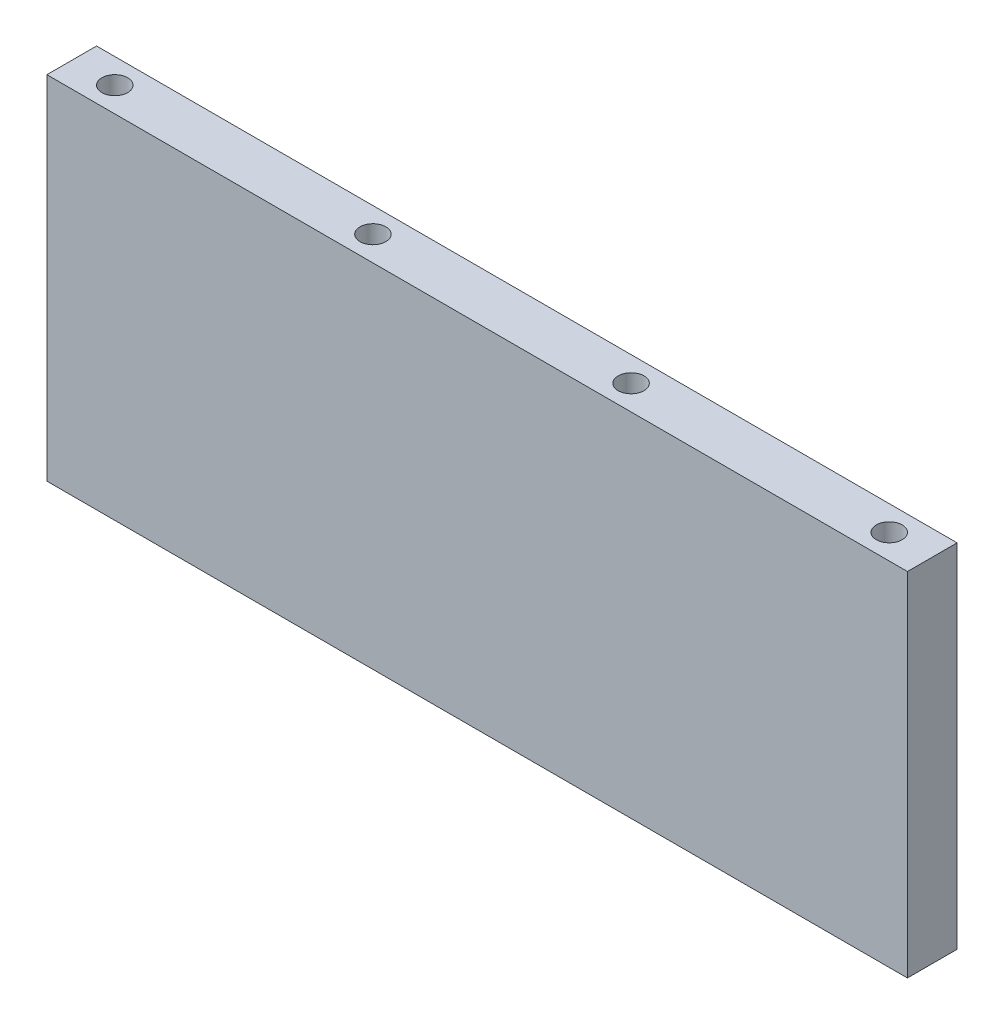
ISO-10303-21;
HEADER;
FILE_DESCRIPTION(('STEP AP214'),'2;1');
FILE_NAME('part.step','',(''),(''),'','','');
FILE_SCHEMA(('AUTOMOTIVE_DESIGN { 1 0 10303 214 1 1 1 1 }'));
ENDSEC;
DATA;
#1=APPLICATION_CONTEXT('core data for automotive mechanical design processes');
#2=APPLICATION_PROTOCOL_DEFINITION('international standard','automotive_design',2000,#1);
#3=PRODUCT_CONTEXT('',#1,'mechanical');
#4=PRODUCT('Part','Part','',(#3));
#5=PRODUCT_RELATED_PRODUCT_CATEGORY('part','',(#4));
#6=PRODUCT_DEFINITION_FORMATION('','',#4);
#7=PRODUCT_DEFINITION_CONTEXT('part definition',#1,'design');
#8=PRODUCT_DEFINITION('design','',#6,#7);
#9=PRODUCT_DEFINITION_SHAPE('','',#8);
#10=(LENGTH_UNIT() NAMED_UNIT(*) SI_UNIT(.MILLI.,.METRE.));
#11=(NAMED_UNIT(*) PLANE_ANGLE_UNIT() SI_UNIT($,.RADIAN.));
#12=(NAMED_UNIT(*) SI_UNIT($,.STERADIAN.) SOLID_ANGLE_UNIT());
#13=UNCERTAINTY_MEASURE_WITH_UNIT(LENGTH_MEASURE(1.E-05),#10,'distance_accuracy_value','');
#14=(GEOMETRIC_REPRESENTATION_CONTEXT(3) GLOBAL_UNCERTAINTY_ASSIGNED_CONTEXT((#13)) GLOBAL_UNIT_ASSIGNED_CONTEXT((#10,
#11,#12)) REPRESENTATION_CONTEXT('',''));
#15=CARTESIAN_POINT('',(0.,0.,0.));
#16=DIRECTION('',(0.,0.,1.));
#17=DIRECTION('',(1.,0.,0.));
#18=AXIS2_PLACEMENT_3D('',#15,#16,#17);
#19=CARTESIAN_POINT('',(0.,0.,6.35));
#20=DIRECTION('',(1.,0.,0.));
#21=DIRECTION('',(0.,0.,-1.));
#22=AXIS2_PLACEMENT_3D('',#19,#20,#21);
#23=PLANE('',#22);
#24=DIRECTION('',(0.,-1.,0.));
#25=VECTOR('',#24,1.);
#26=CARTESIAN_POINT('',(0.,0.,0.));
#27=LINE('',#26,#25);
#28=CARTESIAN_POINT('',(0.,45.,0.));
#29=VERTEX_POINT('',#28);
#30=CARTESIAN_POINT('',(0.,0.,0.));
#31=VERTEX_POINT('',#30);
#32=EDGE_CURVE('E102',#29,#31,#27,.T.);
#33=ORIENTED_EDGE('',*,*,#32,.T.);
#34=DIRECTION('',(0.,0.,-1.));
#35=VECTOR('',#34,1.);
#36=CARTESIAN_POINT('',(0.,0.,6.35));
#37=LINE('',#36,#35);
#38=CARTESIAN_POINT('',(0.,0.,6.35));
#39=VERTEX_POINT('',#38);
#40=EDGE_CURVE('E11',#39,#31,#37,.T.);
#41=ORIENTED_EDGE('',*,*,#40,.F.);
#42=DIRECTION('',(0.,-1.,0.));
#43=VECTOR('',#42,1.);
#44=CARTESIAN_POINT('',(0.,0.,6.35));
#45=LINE('',#44,#43);
#46=CARTESIAN_POINT('',(0.,45.,6.35));
#47=VERTEX_POINT('',#46);
#48=EDGE_CURVE('E90',#47,#39,#45,.T.);
#49=ORIENTED_EDGE('',*,*,#48,.F.);
#50=DIRECTION('',(0.,0.,-1.));
#51=VECTOR('',#50,1.);
#52=CARTESIAN_POINT('',(0.,45.,6.35));
#53=LINE('',#52,#51);
#54=EDGE_CURVE('E98',#47,#29,#53,.T.);
#55=ORIENTED_EDGE('',*,*,#54,.T.);
#56=EDGE_LOOP('',(#33,#41,#49,#55));
#57=FACE_BOUND('',#56,.T.);
#58=ADVANCED_FACE('F39',(#57),#23,.F.);
#59=CARTESIAN_POINT('',(0.,0.,6.35));
#60=DIRECTION('',(0.,1.,0.));
#61=DIRECTION('',(0.,0.,1.));
#62=AXIS2_PLACEMENT_3D('',#59,#60,#61);
#63=PLANE('',#62);
#64=CARTESIAN_POINT('',(5.50000000000001,0.,3.175));
#65=DIRECTION('',(0.,1.,0.));
#66=DIRECTION('',(0.,0.,1.));
#67=AXIS2_PLACEMENT_3D('',#64,#65,#66);
#68=CIRCLE('',#67,1.64999999999999);
#69=CARTESIAN_POINT('',(5.50000000000001,0.,4.82499999999999));
#70=VERTEX_POINT('',#69);
#71=EDGE_CURVE('E133',#70,#70,#68,.T.);
#72=ORIENTED_EDGE('',*,*,#71,.T.);
#73=EDGE_LOOP('',(#72));
#74=FACE_BOUND('',#73,.T.);
#75=CARTESIAN_POINT('',(38.5,0.,3.175));
#76=DIRECTION('',(0.,1.,0.));
#77=DIRECTION('',(0.,0.,1.));
#78=AXIS2_PLACEMENT_3D('',#75,#76,#77);
#79=CIRCLE('',#78,1.64999999999999);
#80=CARTESIAN_POINT('',(38.5,0.,4.82499999999999));
#81=VERTEX_POINT('',#80);
#82=EDGE_CURVE('E127',#81,#81,#79,.T.);
#83=ORIENTED_EDGE('',*,*,#82,.T.);
#84=EDGE_LOOP('',(#83));
#85=FACE_BOUND('',#84,.T.);
#86=CARTESIAN_POINT('',(71.5,0.,3.175));
#87=DIRECTION('',(0.,1.,0.));
#88=DIRECTION('',(0.,0.,1.));
#89=AXIS2_PLACEMENT_3D('',#86,#87,#88);
#90=CIRCLE('',#89,1.65);
#91=CARTESIAN_POINT('',(71.5,0.,4.825));
#92=VERTEX_POINT('',#91);
#93=EDGE_CURVE('E121',#92,#92,#90,.T.);
#94=ORIENTED_EDGE('',*,*,#93,.T.);
#95=EDGE_LOOP('',(#94));
#96=FACE_BOUND('',#95,.T.);
#97=CARTESIAN_POINT('',(104.5,0.,3.175));
#98=DIRECTION('',(0.,1.,0.));
#99=DIRECTION('',(0.,0.,1.));
#100=AXIS2_PLACEMENT_3D('',#97,#98,#99);
#101=CIRCLE('',#100,1.65);
#102=CARTESIAN_POINT('',(104.5,0.,4.825));
#103=VERTEX_POINT('',#102);
#104=EDGE_CURVE('E105',#103,#103,#101,.T.);
#105=ORIENTED_EDGE('',*,*,#104,.T.);
#106=EDGE_LOOP('',(#105));
#107=FACE_BOUND('',#106,.T.);
#108=DIRECTION('',(1.,0.,0.));
#109=VECTOR('',#108,1.);
#110=CARTESIAN_POINT('',(0.,0.,0.));
#111=LINE('',#110,#109);
#112=CARTESIAN_POINT('',(110.,0.,0.));
#113=VERTEX_POINT('',#112);
#114=EDGE_CURVE('E94',#31,#113,#111,.T.);
#115=ORIENTED_EDGE('',*,*,#114,.T.);
#116=DIRECTION('',(0.,0.,-1.));
#117=VECTOR('',#116,1.);
#118=CARTESIAN_POINT('',(110.,0.,6.35));
#119=LINE('',#118,#117);
#120=CARTESIAN_POINT('',(110.,0.,6.35));
#121=VERTEX_POINT('',#120);
#122=EDGE_CURVE('E47',#121,#113,#119,.T.);
#123=ORIENTED_EDGE('',*,*,#122,.F.);
#124=DIRECTION('',(1.,0.,0.));
#125=VECTOR('',#124,1.);
#126=CARTESIAN_POINT('',(0.,0.,6.35));
#127=LINE('',#126,#125);
#128=EDGE_CURVE('E85',#39,#121,#127,.T.);
#129=ORIENTED_EDGE('',*,*,#128,.F.);
#130=ORIENTED_EDGE('',*,*,#40,.T.);
#131=EDGE_LOOP('',(#115,#123,#129,#130));
#132=FACE_BOUND('',#131,.T.);
#133=ADVANCED_FACE('F93',(#74,#85,#96,#107,#132),#63,.F.);
#134=CARTESIAN_POINT('',(110.,0.,6.35));
#135=DIRECTION('',(-1.,0.,0.));
#136=DIRECTION('',(0.,0.,1.));
#137=AXIS2_PLACEMENT_3D('',#134,#135,#136);
#138=PLANE('',#137);
#139=DIRECTION('',(0.,1.,0.));
#140=VECTOR('',#139,1.);
#141=CARTESIAN_POINT('',(110.,0.,0.));
#142=LINE('',#141,#140);
#143=CARTESIAN_POINT('',(110.,45.,0.));
#144=VERTEX_POINT('',#143);
#145=EDGE_CURVE('E72',#113,#144,#142,.T.);
#146=ORIENTED_EDGE('',*,*,#145,.T.);
#147=DIRECTION('',(0.,0.,-1.));
#148=VECTOR('',#147,1.);
#149=CARTESIAN_POINT('',(110.,45.,6.35));
#150=LINE('',#149,#148);
#151=CARTESIAN_POINT('',(110.,45.,6.35));
#152=VERTEX_POINT('',#151);
#153=EDGE_CURVE('E95',#152,#144,#150,.T.);
#154=ORIENTED_EDGE('',*,*,#153,.F.);
#155=DIRECTION('',(0.,1.,0.));
#156=VECTOR('',#155,1.);
#157=CARTESIAN_POINT('',(110.,0.,6.35));
#158=LINE('',#157,#156);
#159=EDGE_CURVE('E88',#121,#152,#158,.T.);
#160=ORIENTED_EDGE('',*,*,#159,.F.);
#161=ORIENTED_EDGE('',*,*,#122,.T.);
#162=EDGE_LOOP('',(#146,#154,#160,#161));
#163=FACE_BOUND('',#162,.T.);
#164=ADVANCED_FACE('F96',(#163),#138,.F.);
#165=CARTESIAN_POINT('',(0.,45.,6.35));
#166=DIRECTION('',(0.,-1.,0.));
#167=DIRECTION('',(0.,0.,-1.));
#168=AXIS2_PLACEMENT_3D('',#165,#166,#167);
#169=PLANE('',#168);
#170=CARTESIAN_POINT('',(5.50000000000001,45.,3.175));
#171=DIRECTION('',(0.,1.,0.));
#172=DIRECTION('',(0.,0.,1.));
#173=AXIS2_PLACEMENT_3D('',#170,#171,#172);
#174=CIRCLE('',#173,1.64999999999999);
#175=CARTESIAN_POINT('',(5.50000000000001,45.,4.82499999999999));
#176=VERTEX_POINT('',#175);
#177=EDGE_CURVE('E136',#176,#176,#174,.T.);
#178=ORIENTED_EDGE('',*,*,#177,.F.);
#179=EDGE_LOOP('',(#178));
#180=FACE_BOUND('',#179,.T.);
#181=CARTESIAN_POINT('',(38.5,45.,3.175));
#182=DIRECTION('',(0.,1.,0.));
#183=DIRECTION('',(0.,0.,1.));
#184=AXIS2_PLACEMENT_3D('',#181,#182,#183);
#185=CIRCLE('',#184,1.64999999999998);
#186=CARTESIAN_POINT('',(38.5,45.,4.82499999999999));
#187=VERTEX_POINT('',#186);
#188=EDGE_CURVE('E130',#187,#187,#185,.T.);
#189=ORIENTED_EDGE('',*,*,#188,.F.);
#190=EDGE_LOOP('',(#189));
#191=FACE_BOUND('',#190,.T.);
#192=CARTESIAN_POINT('',(71.5,45.,3.175));
#193=DIRECTION('',(0.,1.,0.));
#194=DIRECTION('',(0.,0.,1.));
#195=AXIS2_PLACEMENT_3D('',#192,#193,#194);
#196=CIRCLE('',#195,1.64999999999998);
#197=CARTESIAN_POINT('',(71.5,45.,4.82499999999999));
#198=VERTEX_POINT('',#197);
#199=EDGE_CURVE('E124',#198,#198,#196,.T.);
#200=ORIENTED_EDGE('',*,*,#199,.F.);
#201=EDGE_LOOP('',(#200));
#202=FACE_BOUND('',#201,.T.);
#203=CARTESIAN_POINT('',(104.5,45.,3.175));
#204=DIRECTION('',(0.,1.,0.));
#205=DIRECTION('',(0.,0.,1.));
#206=AXIS2_PLACEMENT_3D('',#203,#204,#205);
#207=CIRCLE('',#206,1.64999999999998);
#208=CARTESIAN_POINT('',(104.5,45.,4.82499999999999));
#209=VERTEX_POINT('',#208);
#210=EDGE_CURVE('E118',#209,#209,#207,.T.);
#211=ORIENTED_EDGE('',*,*,#210,.F.);
#212=EDGE_LOOP('',(#211));
#213=FACE_BOUND('',#212,.T.);
#214=DIRECTION('',(-1.,0.,0.));
#215=VECTOR('',#214,1.);
#216=CARTESIAN_POINT('',(0.,45.,0.));
#217=LINE('',#216,#215);
#218=EDGE_CURVE('E78',#144,#29,#217,.T.);
#219=ORIENTED_EDGE('',*,*,#218,.T.);
#220=ORIENTED_EDGE('',*,*,#54,.F.);
#221=DIRECTION('',(-1.,0.,0.));
#222=VECTOR('',#221,1.);
#223=CARTESIAN_POINT('',(0.,45.,6.35));
#224=LINE('',#223,#222);
#225=EDGE_CURVE('E55',#152,#47,#224,.T.);
#226=ORIENTED_EDGE('',*,*,#225,.F.);
#227=ORIENTED_EDGE('',*,*,#153,.T.);
#228=EDGE_LOOP('',(#219,#220,#226,#227));
#229=FACE_BOUND('',#228,.T.);
#230=ADVANCED_FACE('F110',(#180,#191,#202,#213,#229),#169,.F.);
#231=CARTESIAN_POINT('',(0.,0.,6.35));
#232=DIRECTION('',(0.,0.,-1.));
#233=DIRECTION('',(-1.,0.,0.));
#234=AXIS2_PLACEMENT_3D('',#231,#232,#233);
#235=PLANE('',#234);
#236=ORIENTED_EDGE('',*,*,#48,.T.);
#237=ORIENTED_EDGE('',*,*,#128,.T.);
#238=ORIENTED_EDGE('',*,*,#159,.T.);
#239=ORIENTED_EDGE('',*,*,#225,.T.);
#240=EDGE_LOOP('',(#236,#237,#238,#239));
#241=FACE_BOUND('',#240,.T.);
#242=ADVANCED_FACE('F86',(#241),#235,.F.);
#243=CARTESIAN_POINT('',(0.,0.,0.));
#244=DIRECTION('',(0.,0.,-1.));
#245=DIRECTION('',(-1.,0.,0.));
#246=AXIS2_PLACEMENT_3D('',#243,#244,#245);
#247=PLANE('',#246);
#248=ORIENTED_EDGE('',*,*,#32,.F.);
#249=ORIENTED_EDGE('',*,*,#218,.F.);
#250=ORIENTED_EDGE('',*,*,#145,.F.);
#251=ORIENTED_EDGE('',*,*,#114,.F.);
#252=EDGE_LOOP('',(#248,#249,#250,#251));
#253=FACE_BOUND('',#252,.T.);
#254=ADVANCED_FACE('F113',(#253),#247,.T.);
#255=CARTESIAN_POINT('',(104.5,45.,3.175));
#256=DIRECTION('',(0.,1.,0.));
#257=DIRECTION('',(0.,0.,1.));
#258=AXIS2_PLACEMENT_3D('',#255,#256,#257);
#259=CYLINDRICAL_SURFACE('',#258,1.64999999999999);
#260=ORIENTED_EDGE('',*,*,#104,.F.);
#261=EDGE_LOOP('',(#260));
#262=FACE_BOUND('',#261,.T.);
#263=ORIENTED_EDGE('',*,*,#210,.T.);
#264=EDGE_LOOP('',(#263));
#265=FACE_BOUND('',#264,.T.);
#266=ADVANCED_FACE('F151',(#262,#265),#259,.F.);
#267=CARTESIAN_POINT('',(71.5,45.,3.175));
#268=DIRECTION('',(0.,1.,0.));
#269=DIRECTION('',(0.,0.,1.));
#270=AXIS2_PLACEMENT_3D('',#267,#268,#269);
#271=CYLINDRICAL_SURFACE('',#270,1.64999999999999);
#272=ORIENTED_EDGE('',*,*,#93,.F.);
#273=EDGE_LOOP('',(#272));
#274=FACE_BOUND('',#273,.T.);
#275=ORIENTED_EDGE('',*,*,#199,.T.);
#276=EDGE_LOOP('',(#275));
#277=FACE_BOUND('',#276,.T.);
#278=ADVANCED_FACE('F153',(#274,#277),#271,.F.);
#279=CARTESIAN_POINT('',(38.5,45.,3.175));
#280=DIRECTION('',(0.,1.,0.));
#281=DIRECTION('',(0.,0.,1.));
#282=AXIS2_PLACEMENT_3D('',#279,#280,#281);
#283=CYLINDRICAL_SURFACE('',#282,1.64999999999999);
#284=ORIENTED_EDGE('',*,*,#82,.F.);
#285=EDGE_LOOP('',(#284));
#286=FACE_BOUND('',#285,.T.);
#287=ORIENTED_EDGE('',*,*,#188,.T.);
#288=EDGE_LOOP('',(#287));
#289=FACE_BOUND('',#288,.T.);
#290=ADVANCED_FACE('F160',(#286,#289),#283,.F.);
#291=CARTESIAN_POINT('',(5.50000000000001,45.,3.175));
#292=DIRECTION('',(0.,1.,0.));
#293=DIRECTION('',(0.,0.,1.));
#294=AXIS2_PLACEMENT_3D('',#291,#292,#293);
#295=CYLINDRICAL_SURFACE('',#294,1.64999999999999);
#296=ORIENTED_EDGE('',*,*,#71,.F.);
#297=EDGE_LOOP('',(#296));
#298=FACE_BOUND('',#297,.T.);
#299=ORIENTED_EDGE('',*,*,#177,.T.);
#300=EDGE_LOOP('',(#299));
#301=FACE_BOUND('',#300,.T.);
#302=ADVANCED_FACE('F140',(#298,#301),#295,.F.);
#303=CLOSED_SHELL('',(#58,#133,#164,#230,#242,#254,#266,#278,#290,#302));
#304=MANIFOLD_SOLID_BREP('B2',#303);
#305=ADVANCED_BREP_SHAPE_REPRESENTATION('',(#18,#304),#14);
#306=SHAPE_DEFINITION_REPRESENTATION(#9,#305);
ENDSEC;
END-ISO-10303-21;
